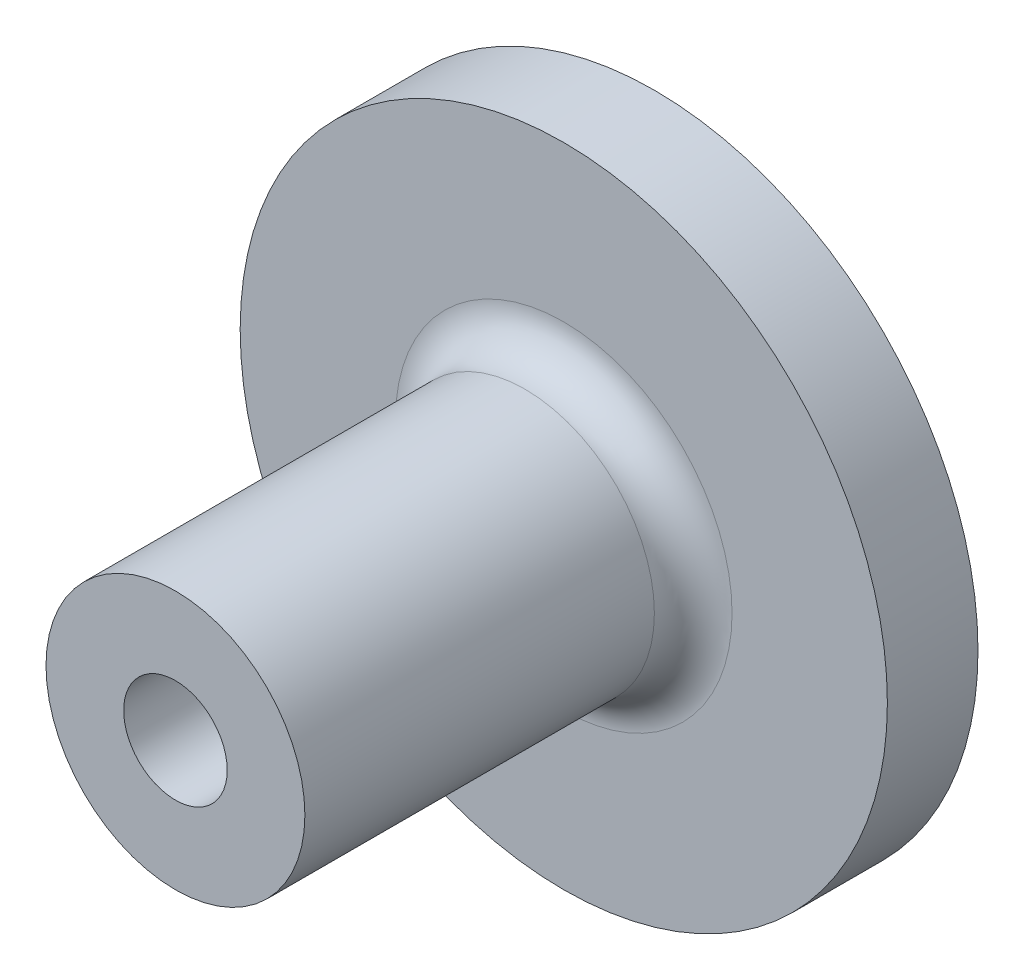
ISO-10303-21;
HEADER;
FILE_DESCRIPTION(('STEP AP214'),'2;1');
FILE_NAME('part.step','',(''),(''),'','','');
FILE_SCHEMA(('AUTOMOTIVE_DESIGN { 1 0 10303 214 1 1 1 1 }'));
ENDSEC;
DATA;
#1=APPLICATION_CONTEXT('core data for automotive mechanical design processes');
#2=APPLICATION_PROTOCOL_DEFINITION('international standard','automotive_design',2000,#1);
#3=PRODUCT_CONTEXT('',#1,'mechanical');
#4=PRODUCT('Part','Part','',(#3));
#5=PRODUCT_RELATED_PRODUCT_CATEGORY('part','',(#4));
#6=PRODUCT_DEFINITION_FORMATION('','',#4);
#7=PRODUCT_DEFINITION_CONTEXT('part definition',#1,'design');
#8=PRODUCT_DEFINITION('design','',#6,#7);
#9=PRODUCT_DEFINITION_SHAPE('','',#8);
#10=(LENGTH_UNIT() NAMED_UNIT(*) SI_UNIT(.MILLI.,.METRE.));
#11=(NAMED_UNIT(*) PLANE_ANGLE_UNIT() SI_UNIT($,.RADIAN.));
#12=(NAMED_UNIT(*) SI_UNIT($,.STERADIAN.) SOLID_ANGLE_UNIT());
#13=UNCERTAINTY_MEASURE_WITH_UNIT(LENGTH_MEASURE(1.E-05),#10,'distance_accuracy_value','');
#14=(GEOMETRIC_REPRESENTATION_CONTEXT(3) GLOBAL_UNCERTAINTY_ASSIGNED_CONTEXT((#13)) GLOBAL_UNIT_ASSIGNED_CONTEXT((#10,
#11,#12)) REPRESENTATION_CONTEXT('',''));
#15=CARTESIAN_POINT('',(0.,0.,0.));
#16=DIRECTION('',(0.,0.,1.));
#17=DIRECTION('',(1.,0.,0.));
#18=AXIS2_PLACEMENT_3D('',#15,#16,#17);
#19=CARTESIAN_POINT('',(0.,0.,7.));
#20=DIRECTION('',(0.,0.,1.));
#21=DIRECTION('',(1.,0.,0.));
#22=AXIS2_PLACEMENT_3D('',#19,#20,#21);
#23=PLANE('',#22);
#24=CARTESIAN_POINT('',(0.,0.,7.));
#25=DIRECTION('',(0.,0.,1.));
#26=DIRECTION('',(1.,0.,0.));
#27=AXIS2_PLACEMENT_3D('',#24,#25,#26);
#28=CIRCLE('',#27,13.);
#29=CARTESIAN_POINT('',(13.,0.,7.));
#30=VERTEX_POINT('',#29);
#31=EDGE_CURVE('E10',#30,#30,#28,.F.);
#32=ORIENTED_EDGE('',*,*,#31,.T.);
#33=EDGE_LOOP('',(#32));
#34=FACE_BOUND('',#33,.T.);
#35=CARTESIAN_POINT('',(0.,0.,7.));
#36=DIRECTION('',(0.,0.,1.));
#37=DIRECTION('',(1.,0.,0.));
#38=AXIS2_PLACEMENT_3D('',#35,#36,#37);
#39=CIRCLE('',#38,25.);
#40=CARTESIAN_POINT('',(25.,0.,7.));
#41=VERTEX_POINT('',#40);
#42=EDGE_CURVE('E40',#41,#41,#39,.T.);
#43=ORIENTED_EDGE('',*,*,#42,.T.);
#44=EDGE_LOOP('',(#43));
#45=FACE_BOUND('',#44,.T.);
#46=ADVANCED_FACE('F29',(#34,#45),#23,.T.);
#47=CARTESIAN_POINT('',(0.,0.,7.));
#48=DIRECTION('',(0.,0.,-1.));
#49=DIRECTION('',(-1.,0.,0.));
#50=AXIS2_PLACEMENT_3D('',#47,#48,#49);
#51=CYLINDRICAL_SURFACE('',#50,25.);
#52=ORIENTED_EDGE('',*,*,#42,.F.);
#53=EDGE_LOOP('',(#52));
#54=FACE_BOUND('',#53,.T.);
#55=CARTESIAN_POINT('',(0.,0.,0.));
#56=DIRECTION('',(0.,0.,1.));
#57=DIRECTION('',(1.,0.,0.));
#58=AXIS2_PLACEMENT_3D('',#55,#56,#57);
#59=CIRCLE('',#58,25.);
#60=CARTESIAN_POINT('',(25.,0.,0.));
#61=VERTEX_POINT('',#60);
#62=EDGE_CURVE('E44',#61,#61,#59,.T.);
#63=ORIENTED_EDGE('',*,*,#62,.T.);
#64=EDGE_LOOP('',(#63));
#65=FACE_BOUND('',#64,.T.);
#66=ADVANCED_FACE('F80',(#54,#65),#51,.T.);
#67=CARTESIAN_POINT('',(0.,0.,0.));
#68=DIRECTION('',(0.,0.,1.));
#69=DIRECTION('',(1.,0.,0.));
#70=AXIS2_PLACEMENT_3D('',#67,#68,#69);
#71=PLANE('',#70);
#72=CARTESIAN_POINT('',(0.,0.,0.));
#73=DIRECTION('',(0.,0.,1.));
#74=DIRECTION('',(1.,0.,0.));
#75=AXIS2_PLACEMENT_3D('',#72,#73,#74);
#76=CIRCLE('',#75,4.);
#77=CARTESIAN_POINT('',(4.,0.,0.));
#78=VERTEX_POINT('',#77);
#79=EDGE_CURVE('E52',#78,#78,#76,.T.);
#80=ORIENTED_EDGE('',*,*,#79,.T.);
#81=EDGE_LOOP('',(#80));
#82=FACE_BOUND('',#81,.T.);
#83=ORIENTED_EDGE('',*,*,#62,.F.);
#84=EDGE_LOOP('',(#83));
#85=FACE_BOUND('',#84,.T.);
#86=ADVANCED_FACE('F59',(#82,#85),#71,.F.);
#87=CARTESIAN_POINT('',(0.,0.,37.));
#88=DIRECTION('',(0.,0.,-1.));
#89=DIRECTION('',(-1.,0.,0.));
#90=AXIS2_PLACEMENT_3D('',#87,#88,#89);
#91=CYLINDRICAL_SURFACE('',#90,10.);
#92=CARTESIAN_POINT('',(0.,0.,10.));
#93=DIRECTION('',(0.,0.,1.));
#94=DIRECTION('',(1.,0.,0.));
#95=AXIS2_PLACEMENT_3D('',#92,#93,#94);
#96=CIRCLE('',#95,10.);
#97=CARTESIAN_POINT('',(10.,0.,10.));
#98=VERTEX_POINT('',#97);
#99=EDGE_CURVE('E36',#98,#98,#96,.T.);
#100=ORIENTED_EDGE('',*,*,#99,.T.);
#101=EDGE_LOOP('',(#100));
#102=FACE_BOUND('',#101,.T.);
#103=CARTESIAN_POINT('',(0.,0.,37.));
#104=DIRECTION('',(0.,0.,1.));
#105=DIRECTION('',(1.,0.,0.));
#106=AXIS2_PLACEMENT_3D('',#103,#104,#105);
#107=CIRCLE('',#106,10.);
#108=CARTESIAN_POINT('',(10.,0.,37.));
#109=VERTEX_POINT('',#108);
#110=EDGE_CURVE('E48',#109,#109,#107,.T.);
#111=ORIENTED_EDGE('',*,*,#110,.F.);
#112=EDGE_LOOP('',(#111));
#113=FACE_BOUND('',#112,.T.);
#114=ADVANCED_FACE('F71',(#102,#113),#91,.T.);
#115=CARTESIAN_POINT('',(0.,0.,37.));
#116=DIRECTION('',(0.,0.,1.));
#117=DIRECTION('',(1.,0.,0.));
#118=AXIS2_PLACEMENT_3D('',#115,#116,#117);
#119=PLANE('',#118);
#120=CARTESIAN_POINT('',(0.,0.,37.));
#121=DIRECTION('',(0.,0.,1.));
#122=DIRECTION('',(1.,0.,0.));
#123=AXIS2_PLACEMENT_3D('',#120,#121,#122);
#124=CIRCLE('',#123,4.);
#125=CARTESIAN_POINT('',(4.,0.,37.));
#126=VERTEX_POINT('',#125);
#127=EDGE_CURVE('E53',#126,#126,#124,.T.);
#128=ORIENTED_EDGE('',*,*,#127,.F.);
#129=EDGE_LOOP('',(#128));
#130=FACE_BOUND('',#129,.T.);
#131=ORIENTED_EDGE('',*,*,#110,.T.);
#132=EDGE_LOOP('',(#131));
#133=FACE_BOUND('',#132,.T.);
#134=ADVANCED_FACE('F68',(#130,#133),#119,.T.);
#135=CARTESIAN_POINT('',(0.,0.,10.));
#136=DIRECTION('',(0.,0.,1.));
#137=DIRECTION('',(1.,0.,0.));
#138=AXIS2_PLACEMENT_3D('',#135,#136,#137);
#139=TOROIDAL_SURFACE('',#138,13.,3.);
#140=ORIENTED_EDGE('',*,*,#31,.F.);
#141=EDGE_LOOP('',(#140));
#142=FACE_BOUND('',#141,.T.);
#143=ORIENTED_EDGE('',*,*,#99,.F.);
#144=EDGE_LOOP('',(#143));
#145=FACE_BOUND('',#144,.T.);
#146=ADVANCED_FACE('F31',(#142,#145),#139,.F.);
#147=CARTESIAN_POINT('',(0.,0.,0.));
#148=DIRECTION('',(0.,0.,1.));
#149=DIRECTION('',(1.,0.,0.));
#150=AXIS2_PLACEMENT_3D('',#147,#148,#149);
#151=CYLINDRICAL_SURFACE('',#150,4.);
#152=ORIENTED_EDGE('',*,*,#79,.F.);
#153=EDGE_LOOP('',(#152));
#154=FACE_BOUND('',#153,.T.);
#155=ORIENTED_EDGE('',*,*,#127,.T.);
#156=EDGE_LOOP('',(#155));
#157=FACE_BOUND('',#156,.T.);
#158=ADVANCED_FACE('F62',(#154,#157),#151,.F.);
#159=CLOSED_SHELL('',(#46,#66,#86,#114,#134,#146,#158));
#160=MANIFOLD_SOLID_BREP('B2',#159);
#161=ADVANCED_BREP_SHAPE_REPRESENTATION('',(#18,#160),#14);
#162=SHAPE_DEFINITION_REPRESENTATION(#9,#161);
ENDSEC;
END-ISO-10303-21;
